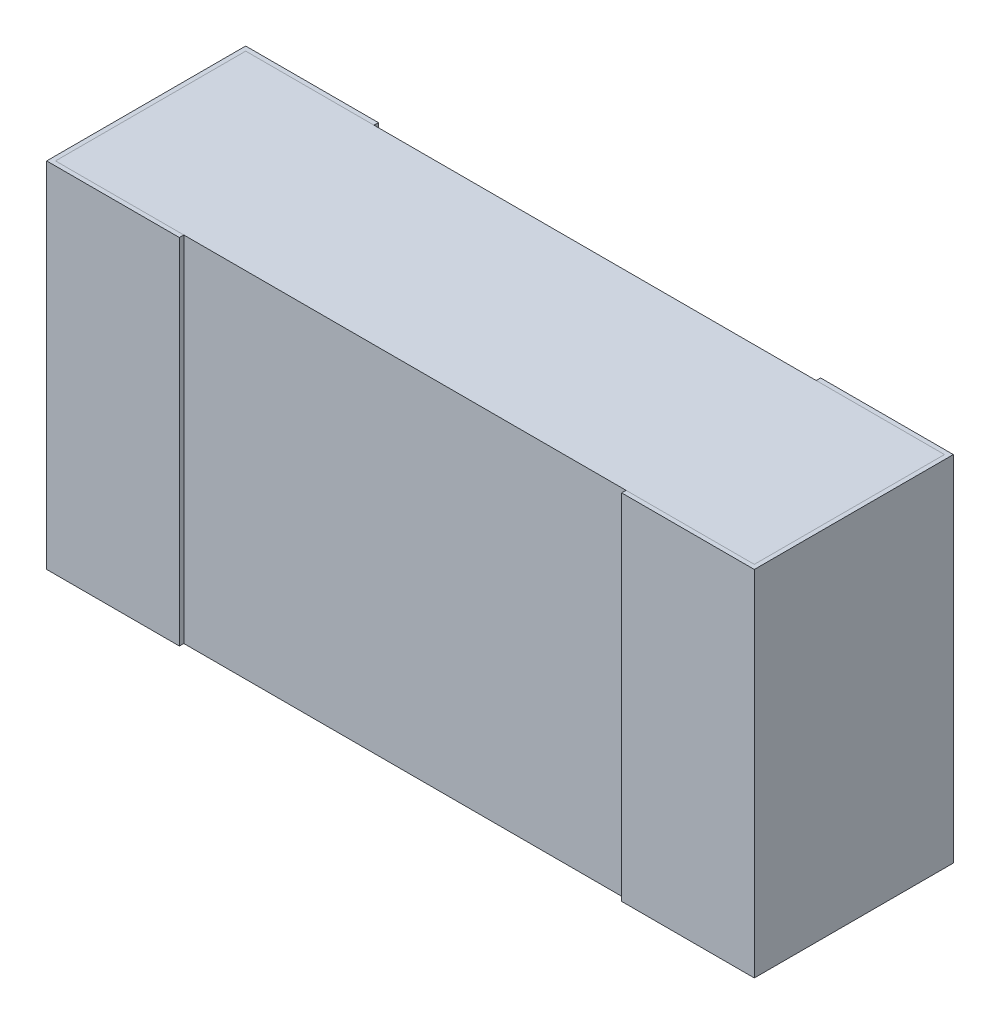
ISO-10303-21;
HEADER;
FILE_DESCRIPTION(('STEP AP214'),'2;1');
FILE_NAME('part.step','',(''),(''),'','','');
FILE_SCHEMA(('AUTOMOTIVE_DESIGN { 1 0 10303 214 1 1 1 1 }'));
ENDSEC;
DATA;
#1=APPLICATION_CONTEXT('core data for automotive mechanical design processes');
#2=APPLICATION_PROTOCOL_DEFINITION('international standard','automotive_design',2000,#1);
#3=PRODUCT_CONTEXT('',#1,'mechanical');
#4=PRODUCT('Part','Part','',(#3));
#5=PRODUCT_RELATED_PRODUCT_CATEGORY('part','',(#4));
#6=PRODUCT_DEFINITION_FORMATION('','',#4);
#7=PRODUCT_DEFINITION_CONTEXT('part definition',#1,'design');
#8=PRODUCT_DEFINITION('design','',#6,#7);
#9=PRODUCT_DEFINITION_SHAPE('','',#8);
#10=(LENGTH_UNIT() NAMED_UNIT(*) SI_UNIT(.MILLI.,.METRE.));
#11=(NAMED_UNIT(*) PLANE_ANGLE_UNIT() SI_UNIT($,.RADIAN.));
#12=(NAMED_UNIT(*) SI_UNIT($,.STERADIAN.) SOLID_ANGLE_UNIT());
#13=UNCERTAINTY_MEASURE_WITH_UNIT(LENGTH_MEASURE(1.E-05),#10,'distance_accuracy_value','');
#14=(GEOMETRIC_REPRESENTATION_CONTEXT(3) GLOBAL_UNCERTAINTY_ASSIGNED_CONTEXT((#13)) GLOBAL_UNIT_ASSIGNED_CONTEXT((#10,
#11,#12)) REPRESENTATION_CONTEXT('',''));
#15=CARTESIAN_POINT('',(0.,0.,0.));
#16=DIRECTION('',(0.,0.,1.));
#17=DIRECTION('',(1.,0.,0.));
#18=AXIS2_PLACEMENT_3D('',#15,#16,#17);
#19=CARTESIAN_POINT('',(0.79,2.03746755693052,-0.0216121610286598));
#20=DIRECTION('',(0.,0.,-1.));
#21=DIRECTION('',(-1.,0.,0.));
#22=AXIS2_PLACEMENT_3D('',#19,#20,#21);
#23=PLANE('',#22);
#24=DIRECTION('',(1.,0.,0.));
#25=VECTOR('',#24,1.);
#26=CARTESIAN_POINT('',(0.79,0.4,-0.0216121610286598));
#27=LINE('',#26,#25);
#28=CARTESIAN_POINT('',(-0.79,0.4,-0.0216121610286598));
#29=VERTEX_POINT('',#28);
#30=CARTESIAN_POINT('',(0.79,0.4,-0.0216121610286598));
#31=VERTEX_POINT('',#30);
#32=EDGE_CURVE('E112',#29,#31,#27,.T.);
#33=ORIENTED_EDGE('',*,*,#32,.F.);
#34=DIRECTION('',(0.,-1.,0.));
#35=VECTOR('',#34,1.);
#36=CARTESIAN_POINT('',(-0.79,2.03746755693052,-0.0216121610286598));
#37=LINE('',#36,#35);
#38=CARTESIAN_POINT('',(-0.79,-0.4,-0.0216121610286598));
#39=VERTEX_POINT('',#38);
#40=EDGE_CURVE('E50',#29,#39,#37,.T.);
#41=ORIENTED_EDGE('',*,*,#40,.T.);
#42=DIRECTION('',(-1.,0.,0.));
#43=VECTOR('',#42,1.);
#44=CARTESIAN_POINT('',(0.79,-0.4,-0.0216121610286598));
#45=LINE('',#44,#43);
#46=CARTESIAN_POINT('',(0.79,-0.4,-0.0216121610286598));
#47=VERTEX_POINT('',#46);
#48=EDGE_CURVE('E106',#47,#39,#45,.T.);
#49=ORIENTED_EDGE('',*,*,#48,.F.);
#50=DIRECTION('',(0.,-1.,0.));
#51=VECTOR('',#50,1.);
#52=CARTESIAN_POINT('',(0.79,2.03746755693052,-0.0216121610286598));
#53=LINE('',#52,#51);
#54=EDGE_CURVE('E95',#31,#47,#53,.T.);
#55=ORIENTED_EDGE('',*,*,#54,.F.);
#56=EDGE_LOOP('',(#33,#41,#49,#55));
#57=FACE_BOUND('',#56,.T.);
#58=ADVANCED_FACE('F46',(#57),#23,.F.);
#59=CARTESIAN_POINT('',(0.79,2.03746755693052,-0.0216121610286598));
#60=DIRECTION('',(-1.,0.,0.));
#61=DIRECTION('',(0.,0.,1.));
#62=AXIS2_PLACEMENT_3D('',#59,#60,#61);
#63=PLANE('',#62);
#64=DIRECTION('',(0.,0.,-1.));
#65=VECTOR('',#64,1.);
#66=CARTESIAN_POINT('',(0.79,0.4,-0.0216121610286598));
#67=LINE('',#66,#65);
#68=CARTESIAN_POINT('',(0.79,0.4,-0.45161216102866));
#69=VERTEX_POINT('',#68);
#70=EDGE_CURVE('E55',#31,#69,#67,.T.);
#71=ORIENTED_EDGE('',*,*,#70,.F.);
#72=ORIENTED_EDGE('',*,*,#54,.T.);
#73=DIRECTION('',(0.,0.,1.));
#74=VECTOR('',#73,1.);
#75=CARTESIAN_POINT('',(0.79,-0.4,-0.0216121610286598));
#76=LINE('',#75,#74);
#77=CARTESIAN_POINT('',(0.79,-0.4,-0.45161216102866));
#78=VERTEX_POINT('',#77);
#79=EDGE_CURVE('E101',#78,#47,#76,.T.);
#80=ORIENTED_EDGE('',*,*,#79,.F.);
#81=DIRECTION('',(0.,-1.,0.));
#82=VECTOR('',#81,1.);
#83=CARTESIAN_POINT('',(0.79,2.03746755693052,-0.45161216102866));
#84=LINE('',#83,#82);
#85=EDGE_CURVE('E90',#69,#78,#84,.T.);
#86=ORIENTED_EDGE('',*,*,#85,.F.);
#87=EDGE_LOOP('',(#71,#72,#80,#86));
#88=FACE_BOUND('',#87,.T.);
#89=ADVANCED_FACE('F105',(#88),#63,.F.);
#90=CARTESIAN_POINT('',(0.79,2.03746755693052,-0.45161216102866));
#91=DIRECTION('',(0.,0.,1.));
#92=DIRECTION('',(1.,0.,0.));
#93=AXIS2_PLACEMENT_3D('',#90,#91,#92);
#94=PLANE('',#93);
#95=DIRECTION('',(-1.,0.,0.));
#96=VECTOR('',#95,1.);
#97=CARTESIAN_POINT('',(0.79,0.4,-0.45161216102866));
#98=LINE('',#97,#96);
#99=CARTESIAN_POINT('',(-0.79,0.4,-0.45161216102866));
#100=VERTEX_POINT('',#99);
#101=EDGE_CURVE('E12',#69,#100,#98,.T.);
#102=ORIENTED_EDGE('',*,*,#101,.F.);
#103=ORIENTED_EDGE('',*,*,#85,.T.);
#104=DIRECTION('',(1.,0.,0.));
#105=VECTOR('',#104,1.);
#106=CARTESIAN_POINT('',(0.79,-0.4,-0.45161216102866));
#107=LINE('',#106,#105);
#108=CARTESIAN_POINT('',(-0.79,-0.4,-0.45161216102866));
#109=VERTEX_POINT('',#108);
#110=EDGE_CURVE('E93',#109,#78,#107,.T.);
#111=ORIENTED_EDGE('',*,*,#110,.F.);
#112=DIRECTION('',(0.,-1.,0.));
#113=VECTOR('',#112,1.);
#114=CARTESIAN_POINT('',(-0.79,2.03746755693052,-0.45161216102866));
#115=LINE('',#114,#113);
#116=EDGE_CURVE('E71',#100,#109,#115,.T.);
#117=ORIENTED_EDGE('',*,*,#116,.F.);
#118=EDGE_LOOP('',(#102,#103,#111,#117));
#119=FACE_BOUND('',#118,.T.);
#120=ADVANCED_FACE('F92',(#119),#94,.F.);
#121=CARTESIAN_POINT('',(-0.79,2.03746755693052,-0.0216121610286598));
#122=DIRECTION('',(1.,0.,0.));
#123=DIRECTION('',(0.,0.,-1.));
#124=AXIS2_PLACEMENT_3D('',#121,#122,#123);
#125=PLANE('',#124);
#126=DIRECTION('',(0.,0.,1.));
#127=VECTOR('',#126,1.);
#128=CARTESIAN_POINT('',(-0.79,0.4,-0.0216121610286598));
#129=LINE('',#128,#127);
#130=EDGE_CURVE('E115',#100,#29,#129,.T.);
#131=ORIENTED_EDGE('',*,*,#130,.F.);
#132=ORIENTED_EDGE('',*,*,#116,.T.);
#133=DIRECTION('',(0.,0.,-1.));
#134=VECTOR('',#133,1.);
#135=CARTESIAN_POINT('',(-0.79,-0.4,-0.0216121610286598));
#136=LINE('',#135,#134);
#137=EDGE_CURVE('E103',#39,#109,#136,.T.);
#138=ORIENTED_EDGE('',*,*,#137,.F.);
#139=ORIENTED_EDGE('',*,*,#40,.F.);
#140=EDGE_LOOP('',(#131,#132,#138,#139));
#141=FACE_BOUND('',#140,.T.);
#142=ADVANCED_FACE('F119',(#141),#125,.F.);
#143=CARTESIAN_POINT('',(0.8,0.4,-0.0116121610286598));
#144=DIRECTION('',(0.,1.,0.));
#145=DIRECTION('',(0.,0.,1.));
#146=AXIS2_PLACEMENT_3D('',#143,#144,#145);
#147=PLANE('',#146);
#148=ORIENTED_EDGE('',*,*,#130,.T.);
#149=ORIENTED_EDGE('',*,*,#32,.T.);
#150=ORIENTED_EDGE('',*,*,#70,.T.);
#151=ORIENTED_EDGE('',*,*,#101,.T.);
#152=EDGE_LOOP('',(#148,#149,#150,#151));
#153=FACE_BOUND('',#152,.T.);
#154=ADVANCED_FACE('F48',(#153),#147,.T.);
#155=CARTESIAN_POINT('',(0.8,-0.4,-0.0116121610286598));
#156=DIRECTION('',(0.,1.,0.));
#157=DIRECTION('',(0.,0.,1.));
#158=AXIS2_PLACEMENT_3D('',#155,#156,#157);
#159=PLANE('',#158);
#160=ORIENTED_EDGE('',*,*,#48,.T.);
#161=ORIENTED_EDGE('',*,*,#137,.T.);
#162=ORIENTED_EDGE('',*,*,#110,.T.);
#163=ORIENTED_EDGE('',*,*,#79,.T.);
#164=EDGE_LOOP('',(#160,#161,#162,#163));
#165=FACE_BOUND('',#164,.T.);
#166=ADVANCED_FACE('F100',(#165),#159,.F.);
#167=CLOSED_SHELL('',(#58,#89,#120,#142,#154,#166));
#168=MANIFOLD_SOLID_BREP('B2',#167);
#169=CARTESIAN_POINT('',(-0.5,0.4,-0.0116121610286598));
#170=DIRECTION('',(-1.,0.,0.));
#171=DIRECTION('',(0.,0.,1.));
#172=AXIS2_PLACEMENT_3D('',#169,#170,#171);
#173=PLANE('',#172);
#174=DIRECTION('',(0.,0.,-1.));
#175=VECTOR('',#174,1.);
#176=CARTESIAN_POINT('',(-0.5,-0.4,-0.0116121610286598));
#177=LINE('',#176,#175);
#178=CARTESIAN_POINT('',(-0.5,-0.4,-0.0116121610286598));
#179=VERTEX_POINT('',#178);
#180=CARTESIAN_POINT('',(-0.5,-0.4,-0.0216121610286598));
#181=VERTEX_POINT('',#180);
#182=EDGE_CURVE('E275',#179,#181,#177,.T.);
#183=ORIENTED_EDGE('',*,*,#182,.T.);
#184=DIRECTION('',(0.,-1.,0.));
#185=VECTOR('',#184,1.);
#186=CARTESIAN_POINT('',(-0.5,0.4,-0.0216121610286598));
#187=LINE('',#186,#185);
#188=CARTESIAN_POINT('',(-0.5,0.4,-0.0216121610286598));
#189=VERTEX_POINT('',#188);
#190=EDGE_CURVE('E44',#189,#181,#187,.T.);
#191=ORIENTED_EDGE('',*,*,#190,.F.);
#192=DIRECTION('',(0.,0.,-1.));
#193=VECTOR('',#192,1.);
#194=CARTESIAN_POINT('',(-0.5,0.4,-0.0116121610286598));
#195=LINE('',#194,#193);
#196=CARTESIAN_POINT('',(-0.5,0.4,-0.0116121610286598));
#197=VERTEX_POINT('',#196);
#198=EDGE_CURVE('E289',#197,#189,#195,.T.);
#199=ORIENTED_EDGE('',*,*,#198,.F.);
#200=DIRECTION('',(0.,-1.,0.));
#201=VECTOR('',#200,1.);
#202=CARTESIAN_POINT('',(-0.5,0.4,-0.0116121610286598));
#203=LINE('',#202,#201);
#204=EDGE_CURVE('E271',#197,#179,#203,.T.);
#205=ORIENTED_EDGE('',*,*,#204,.T.);
#206=EDGE_LOOP('',(#183,#191,#199,#205));
#207=FACE_BOUND('',#206,.T.);
#208=ADVANCED_FACE('F179',(#207),#173,.F.);
#209=CARTESIAN_POINT('',(-0.5,0.4,-0.0216121610286598));
#210=DIRECTION('',(0.,0.,1.));
#211=DIRECTION('',(1.,0.,0.));
#212=AXIS2_PLACEMENT_3D('',#209,#210,#211);
#213=PLANE('',#212);
#214=DIRECTION('',(-1.,0.,0.));
#215=VECTOR('',#214,1.);
#216=CARTESIAN_POINT('',(-0.5,-0.4,-0.0216121610286598));
#217=LINE('',#216,#215);
#218=CARTESIAN_POINT('',(-0.79,-0.4,-0.0216121610286598));
#219=VERTEX_POINT('',#218);
#220=EDGE_CURVE('E278',#181,#219,#217,.T.);
#221=ORIENTED_EDGE('',*,*,#220,.T.);
#222=DIRECTION('',(0.,-1.,0.));
#223=VECTOR('',#222,1.);
#224=CARTESIAN_POINT('',(-0.79,0.4,-0.0216121610286598));
#225=LINE('',#224,#223);
#226=CARTESIAN_POINT('',(-0.79,0.4,-0.0216121610286598));
#227=VERTEX_POINT('',#226);
#228=EDGE_CURVE('E187',#227,#219,#225,.T.);
#229=ORIENTED_EDGE('',*,*,#228,.F.);
#230=DIRECTION('',(-1.,0.,0.));
#231=VECTOR('',#230,1.);
#232=CARTESIAN_POINT('',(-0.5,0.4,-0.0216121610286598));
#233=LINE('',#232,#231);
#234=EDGE_CURVE('E238',#189,#227,#233,.T.);
#235=ORIENTED_EDGE('',*,*,#234,.F.);
#236=ORIENTED_EDGE('',*,*,#190,.T.);
#237=EDGE_LOOP('',(#221,#229,#235,#236));
#238=FACE_BOUND('',#237,.T.);
#239=ADVANCED_FACE('F324',(#238),#213,.F.);
#240=CARTESIAN_POINT('',(-0.79,0.4,-0.0216121610286598));
#241=DIRECTION('',(-1.,0.,0.));
#242=DIRECTION('',(0.,0.,1.));
#243=AXIS2_PLACEMENT_3D('',#240,#241,#242);
#244=PLANE('',#243);
#245=DIRECTION('',(0.,0.,-1.));
#246=VECTOR('',#245,1.);
#247=CARTESIAN_POINT('',(-0.79,-0.4,-0.0216121610286598));
#248=LINE('',#247,#246);
#249=CARTESIAN_POINT('',(-0.79,-0.4,-0.45161216102866));
#250=VERTEX_POINT('',#249);
#251=EDGE_CURVE('E280',#219,#250,#248,.T.);
#252=ORIENTED_EDGE('',*,*,#251,.T.);
#253=DIRECTION('',(0.,-1.,0.));
#254=VECTOR('',#253,1.);
#255=CARTESIAN_POINT('',(-0.79,0.4,-0.45161216102866));
#256=LINE('',#255,#254);
#257=CARTESIAN_POINT('',(-0.79,0.4,-0.45161216102866));
#258=VERTEX_POINT('',#257);
#259=EDGE_CURVE('E296',#258,#250,#256,.T.);
#260=ORIENTED_EDGE('',*,*,#259,.F.);
#261=DIRECTION('',(0.,0.,-1.));
#262=VECTOR('',#261,1.);
#263=CARTESIAN_POINT('',(-0.79,0.4,-0.0216121610286598));
#264=LINE('',#263,#262);
#265=EDGE_CURVE('E304',#227,#258,#264,.T.);
#266=ORIENTED_EDGE('',*,*,#265,.F.);
#267=ORIENTED_EDGE('',*,*,#228,.T.);
#268=EDGE_LOOP('',(#252,#260,#266,#267));
#269=FACE_BOUND('',#268,.T.);
#270=ADVANCED_FACE('F302',(#269),#244,.F.);
#271=CARTESIAN_POINT('',(-0.79,0.4,-0.45161216102866));
#272=DIRECTION('',(0.,0.,-1.));
#273=DIRECTION('',(-1.,0.,0.));
#274=AXIS2_PLACEMENT_3D('',#271,#272,#273);
#275=PLANE('',#274);
#276=DIRECTION('',(1.,0.,0.));
#277=VECTOR('',#276,1.);
#278=CARTESIAN_POINT('',(-0.79,-0.4,-0.45161216102866));
#279=LINE('',#278,#277);
#280=CARTESIAN_POINT('',(-0.5,-0.4,-0.45161216102866));
#281=VERTEX_POINT('',#280);
#282=EDGE_CURVE('E282',#250,#281,#279,.T.);
#283=ORIENTED_EDGE('',*,*,#282,.T.);
#284=DIRECTION('',(0.,-1.,0.));
#285=VECTOR('',#284,1.);
#286=CARTESIAN_POINT('',(-0.5,0.4,-0.45161216102866));
#287=LINE('',#286,#285);
#288=CARTESIAN_POINT('',(-0.5,0.4,-0.45161216102866));
#289=VERTEX_POINT('',#288);
#290=EDGE_CURVE('E293',#289,#281,#287,.T.);
#291=ORIENTED_EDGE('',*,*,#290,.F.);
#292=DIRECTION('',(1.,0.,0.));
#293=VECTOR('',#292,1.);
#294=CARTESIAN_POINT('',(-0.79,0.4,-0.45161216102866));
#295=LINE('',#294,#293);
#296=EDGE_CURVE('E316',#258,#289,#295,.T.);
#297=ORIENTED_EDGE('',*,*,#296,.F.);
#298=ORIENTED_EDGE('',*,*,#259,.T.);
#299=EDGE_LOOP('',(#283,#291,#297,#298));
#300=FACE_BOUND('',#299,.T.);
#301=ADVANCED_FACE('F312',(#300),#275,.F.);
#302=CARTESIAN_POINT('',(-0.5,0.4,-0.45161216102866));
#303=DIRECTION('',(-1.,0.,0.));
#304=DIRECTION('',(0.,0.,1.));
#305=AXIS2_PLACEMENT_3D('',#302,#303,#304);
#306=PLANE('',#305);
#307=DIRECTION('',(0.,0.,-1.));
#308=VECTOR('',#307,1.);
#309=CARTESIAN_POINT('',(-0.5,-0.4,-0.45161216102866));
#310=LINE('',#309,#308);
#311=CARTESIAN_POINT('',(-0.5,-0.4,-0.46161216102866));
#312=VERTEX_POINT('',#311);
#313=EDGE_CURVE('E284',#281,#312,#310,.T.);
#314=ORIENTED_EDGE('',*,*,#313,.T.);
#315=DIRECTION('',(0.,-1.,0.));
#316=VECTOR('',#315,1.);
#317=CARTESIAN_POINT('',(-0.5,0.4,-0.46161216102866));
#318=LINE('',#317,#316);
#319=CARTESIAN_POINT('',(-0.5,0.4,-0.46161216102866));
#320=VERTEX_POINT('',#319);
#321=EDGE_CURVE('E266',#320,#312,#318,.T.);
#322=ORIENTED_EDGE('',*,*,#321,.F.);
#323=DIRECTION('',(0.,0.,-1.));
#324=VECTOR('',#323,1.);
#325=CARTESIAN_POINT('',(-0.5,0.4,-0.45161216102866));
#326=LINE('',#325,#324);
#327=EDGE_CURVE('E257',#289,#320,#326,.T.);
#328=ORIENTED_EDGE('',*,*,#327,.F.);
#329=ORIENTED_EDGE('',*,*,#290,.T.);
#330=EDGE_LOOP('',(#314,#322,#328,#329));
#331=FACE_BOUND('',#330,.T.);
#332=ADVANCED_FACE('F315',(#331),#306,.F.);
#333=CARTESIAN_POINT('',(-0.8,0.4,-0.46161216102866));
#334=DIRECTION('',(0.,0.,1.));
#335=DIRECTION('',(1.,0.,0.));
#336=AXIS2_PLACEMENT_3D('',#333,#334,#335);
#337=PLANE('',#336);
#338=DIRECTION('',(-1.,0.,0.));
#339=VECTOR('',#338,1.);
#340=CARTESIAN_POINT('',(-0.8,-0.4,-0.46161216102866));
#341=LINE('',#340,#339);
#342=CARTESIAN_POINT('',(-0.8,-0.4,-0.46161216102866));
#343=VERTEX_POINT('',#342);
#344=EDGE_CURVE('E265',#312,#343,#341,.T.);
#345=ORIENTED_EDGE('',*,*,#344,.T.);
#346=DIRECTION('',(0.,-1.,0.));
#347=VECTOR('',#346,1.);
#348=CARTESIAN_POINT('',(-0.8,0.4,-0.46161216102866));
#349=LINE('',#348,#347);
#350=CARTESIAN_POINT('',(-0.8,0.4,-0.46161216102866));
#351=VERTEX_POINT('',#350);
#352=EDGE_CURVE('E262',#351,#343,#349,.T.);
#353=ORIENTED_EDGE('',*,*,#352,.F.);
#354=DIRECTION('',(-1.,0.,0.));
#355=VECTOR('',#354,1.);
#356=CARTESIAN_POINT('',(-0.8,0.4,-0.46161216102866));
#357=LINE('',#356,#355);
#358=EDGE_CURVE('E251',#320,#351,#357,.T.);
#359=ORIENTED_EDGE('',*,*,#358,.F.);
#360=ORIENTED_EDGE('',*,*,#321,.T.);
#361=EDGE_LOOP('',(#345,#353,#359,#360));
#362=FACE_BOUND('',#361,.T.);
#363=ADVANCED_FACE('F263',(#362),#337,.F.);
#364=CARTESIAN_POINT('',(-0.8,0.4,-0.0116121610286598));
#365=DIRECTION('',(1.,0.,0.));
#366=DIRECTION('',(0.,0.,-1.));
#367=AXIS2_PLACEMENT_3D('',#364,#365,#366);
#368=PLANE('',#367);
#369=DIRECTION('',(0.,0.,1.));
#370=VECTOR('',#369,1.);
#371=CARTESIAN_POINT('',(-0.8,-0.4,-0.0116121610286598));
#372=LINE('',#371,#370);
#373=CARTESIAN_POINT('',(-0.8,-0.4,-0.0116121610286598));
#374=VERTEX_POINT('',#373);
#375=EDGE_CURVE('E224',#343,#374,#372,.T.);
#376=ORIENTED_EDGE('',*,*,#375,.T.);
#377=DIRECTION('',(0.,-1.,0.));
#378=VECTOR('',#377,1.);
#379=CARTESIAN_POINT('',(-0.8,0.4,-0.0116121610286598));
#380=LINE('',#379,#378);
#381=CARTESIAN_POINT('',(-0.8,0.4,-0.0116121610286598));
#382=VERTEX_POINT('',#381);
#383=EDGE_CURVE('E267',#382,#374,#380,.T.);
#384=ORIENTED_EDGE('',*,*,#383,.F.);
#385=DIRECTION('',(0.,0.,1.));
#386=VECTOR('',#385,1.);
#387=CARTESIAN_POINT('',(-0.8,0.4,-0.0116121610286598));
#388=LINE('',#387,#386);
#389=EDGE_CURVE('E255',#351,#382,#388,.T.);
#390=ORIENTED_EDGE('',*,*,#389,.F.);
#391=ORIENTED_EDGE('',*,*,#352,.T.);
#392=EDGE_LOOP('',(#376,#384,#390,#391));
#393=FACE_BOUND('',#392,.T.);
#394=ADVANCED_FACE('F269',(#393),#368,.F.);
#395=CARTESIAN_POINT('',(-0.5,0.4,-0.0116121610286598));
#396=DIRECTION('',(0.,0.,-1.));
#397=DIRECTION('',(-1.,0.,0.));
#398=AXIS2_PLACEMENT_3D('',#395,#396,#397);
#399=PLANE('',#398);
#400=DIRECTION('',(1.,0.,0.));
#401=VECTOR('',#400,1.);
#402=CARTESIAN_POINT('',(-0.5,-0.4,-0.0116121610286598));
#403=LINE('',#402,#401);
#404=EDGE_CURVE('E230',#374,#179,#403,.T.);
#405=ORIENTED_EDGE('',*,*,#404,.T.);
#406=ORIENTED_EDGE('',*,*,#204,.F.);
#407=DIRECTION('',(1.,0.,0.));
#408=VECTOR('',#407,1.);
#409=CARTESIAN_POINT('',(-0.5,0.4,-0.0116121610286598));
#410=LINE('',#409,#408);
#411=EDGE_CURVE('E195',#382,#197,#410,.T.);
#412=ORIENTED_EDGE('',*,*,#411,.F.);
#413=ORIENTED_EDGE('',*,*,#383,.T.);
#414=EDGE_LOOP('',(#405,#406,#412,#413));
#415=FACE_BOUND('',#414,.T.);
#416=ADVANCED_FACE('F340',(#415),#399,.F.);
#417=CARTESIAN_POINT('',(-0.5,0.4,-0.0216121610286598));
#418=DIRECTION('',(0.,1.,0.));
#419=DIRECTION('',(0.,0.,1.));
#420=AXIS2_PLACEMENT_3D('',#417,#418,#419);
#421=PLANE('',#420);
#422=ORIENTED_EDGE('',*,*,#198,.T.);
#423=ORIENTED_EDGE('',*,*,#234,.T.);
#424=ORIENTED_EDGE('',*,*,#265,.T.);
#425=ORIENTED_EDGE('',*,*,#296,.T.);
#426=ORIENTED_EDGE('',*,*,#327,.T.);
#427=ORIENTED_EDGE('',*,*,#358,.T.);
#428=ORIENTED_EDGE('',*,*,#389,.T.);
#429=ORIENTED_EDGE('',*,*,#411,.T.);
#430=EDGE_LOOP('',(#422,#423,#424,#425,#426,#427,#428,#429));
#431=FACE_BOUND('',#430,.T.);
#432=ADVANCED_FACE('F253',(#431),#421,.T.);
#433=CARTESIAN_POINT('',(-0.5,-0.4,-0.0216121610286598));
#434=DIRECTION('',(0.,1.,0.));
#435=DIRECTION('',(0.,0.,1.));
#436=AXIS2_PLACEMENT_3D('',#433,#434,#435);
#437=PLANE('',#436);
#438=ORIENTED_EDGE('',*,*,#182,.F.);
#439=ORIENTED_EDGE('',*,*,#404,.F.);
#440=ORIENTED_EDGE('',*,*,#375,.F.);
#441=ORIENTED_EDGE('',*,*,#344,.F.);
#442=ORIENTED_EDGE('',*,*,#313,.F.);
#443=ORIENTED_EDGE('',*,*,#282,.F.);
#444=ORIENTED_EDGE('',*,*,#251,.F.);
#445=ORIENTED_EDGE('',*,*,#220,.F.);
#446=EDGE_LOOP('',(#438,#439,#440,#441,#442,#443,#444,#445));
#447=FACE_BOUND('',#446,.T.);
#448=ADVANCED_FACE('F308',(#447),#437,.F.);
#449=CLOSED_SHELL('',(#208,#239,#270,#301,#332,#363,#394,#416,#432,#448));
#450=MANIFOLD_SOLID_BREP('B6',#449);
#451=CARTESIAN_POINT('',(0.5,0.4,-0.0116121610286598));
#452=DIRECTION('',(0.,0.,-1.));
#453=DIRECTION('',(-1.,0.,0.));
#454=AXIS2_PLACEMENT_3D('',#451,#452,#453);
#455=PLANE('',#454);
#456=DIRECTION('',(1.,0.,0.));
#457=VECTOR('',#456,1.);
#458=CARTESIAN_POINT('',(0.5,-0.4,-0.0116121610286598));
#459=LINE('',#458,#457);
#460=CARTESIAN_POINT('',(0.5,-0.4,-0.0116121610286598));
#461=VERTEX_POINT('',#460);
#462=CARTESIAN_POINT('',(0.8,-0.4,-0.0116121610286598));
#463=VERTEX_POINT('',#462);
#464=EDGE_CURVE('E503',#461,#463,#459,.T.);
#465=ORIENTED_EDGE('',*,*,#464,.T.);
#466=DIRECTION('',(0.,-1.,0.));
#467=VECTOR('',#466,1.);
#468=CARTESIAN_POINT('',(0.8,0.4,-0.0116121610286598));
#469=LINE('',#468,#467);
#470=CARTESIAN_POINT('',(0.8,0.4,-0.0116121610286598));
#471=VERTEX_POINT('',#470);
#472=EDGE_CURVE('E177',#471,#463,#469,.T.);
#473=ORIENTED_EDGE('',*,*,#472,.F.);
#474=DIRECTION('',(1.,0.,0.));
#475=VECTOR('',#474,1.);
#476=CARTESIAN_POINT('',(0.5,0.4,-0.0116121610286598));
#477=LINE('',#476,#475);
#478=CARTESIAN_POINT('',(0.5,0.4,-0.0116121610286598));
#479=VERTEX_POINT('',#478);
#480=EDGE_CURVE('E517',#479,#471,#477,.T.);
#481=ORIENTED_EDGE('',*,*,#480,.F.);
#482=DIRECTION('',(0.,-1.,0.));
#483=VECTOR('',#482,1.);
#484=CARTESIAN_POINT('',(0.5,0.4,-0.0116121610286598));
#485=LINE('',#484,#483);
#486=EDGE_CURVE('E499',#479,#461,#485,.T.);
#487=ORIENTED_EDGE('',*,*,#486,.T.);
#488=EDGE_LOOP('',(#465,#473,#481,#487));
#489=FACE_BOUND('',#488,.T.);
#490=ADVANCED_FACE('F407',(#489),#455,.F.);
#491=CARTESIAN_POINT('',(0.8,0.4,-0.0116121610286598));
#492=DIRECTION('',(-1.,0.,0.));
#493=DIRECTION('',(0.,0.,1.));
#494=AXIS2_PLACEMENT_3D('',#491,#492,#493);
#495=PLANE('',#494);
#496=DIRECTION('',(0.,0.,-1.));
#497=VECTOR('',#496,1.);
#498=CARTESIAN_POINT('',(0.8,-0.4,-0.0116121610286598));
#499=LINE('',#498,#497);
#500=CARTESIAN_POINT('',(0.8,-0.4,-0.46161216102866));
#501=VERTEX_POINT('',#500);
#502=EDGE_CURVE('E506',#463,#501,#499,.T.);
#503=ORIENTED_EDGE('',*,*,#502,.T.);
#504=DIRECTION('',(0.,-1.,0.));
#505=VECTOR('',#504,1.);
#506=CARTESIAN_POINT('',(0.8,0.4,-0.46161216102866));
#507=LINE('',#506,#505);
#508=CARTESIAN_POINT('',(0.8,0.4,-0.46161216102866));
#509=VERTEX_POINT('',#508);
#510=EDGE_CURVE('E415',#509,#501,#507,.T.);
#511=ORIENTED_EDGE('',*,*,#510,.F.);
#512=DIRECTION('',(0.,0.,-1.));
#513=VECTOR('',#512,1.);
#514=CARTESIAN_POINT('',(0.8,0.4,-0.0116121610286598));
#515=LINE('',#514,#513);
#516=EDGE_CURVE('E466',#471,#509,#515,.T.);
#517=ORIENTED_EDGE('',*,*,#516,.F.);
#518=ORIENTED_EDGE('',*,*,#472,.T.);
#519=EDGE_LOOP('',(#503,#511,#517,#518));
#520=FACE_BOUND('',#519,.T.);
#521=ADVANCED_FACE('F552',(#520),#495,.F.);
#522=CARTESIAN_POINT('',(0.8,0.4,-0.46161216102866));
#523=DIRECTION('',(0.,0.,1.));
#524=DIRECTION('',(1.,0.,0.));
#525=AXIS2_PLACEMENT_3D('',#522,#523,#524);
#526=PLANE('',#525);
#527=DIRECTION('',(-1.,0.,0.));
#528=VECTOR('',#527,1.);
#529=CARTESIAN_POINT('',(0.8,-0.4,-0.46161216102866));
#530=LINE('',#529,#528);
#531=CARTESIAN_POINT('',(0.5,-0.4,-0.46161216102866));
#532=VERTEX_POINT('',#531);
#533=EDGE_CURVE('E508',#501,#532,#530,.T.);
#534=ORIENTED_EDGE('',*,*,#533,.T.);
#535=DIRECTION('',(0.,-1.,0.));
#536=VECTOR('',#535,1.);
#537=CARTESIAN_POINT('',(0.5,0.4,-0.46161216102866));
#538=LINE('',#537,#536);
#539=CARTESIAN_POINT('',(0.5,0.4,-0.46161216102866));
#540=VERTEX_POINT('',#539);
#541=EDGE_CURVE('E524',#540,#532,#538,.T.);
#542=ORIENTED_EDGE('',*,*,#541,.F.);
#543=DIRECTION('',(-1.,0.,0.));
#544=VECTOR('',#543,1.);
#545=CARTESIAN_POINT('',(0.8,0.4,-0.46161216102866));
#546=LINE('',#545,#544);
#547=EDGE_CURVE('E532',#509,#540,#546,.T.);
#548=ORIENTED_EDGE('',*,*,#547,.F.);
#549=ORIENTED_EDGE('',*,*,#510,.T.);
#550=EDGE_LOOP('',(#534,#542,#548,#549));
#551=FACE_BOUND('',#550,.T.);
#552=ADVANCED_FACE('F530',(#551),#526,.F.);
#553=CARTESIAN_POINT('',(0.5,0.4,-0.45161216102866));
#554=DIRECTION('',(1.,0.,0.));
#555=DIRECTION('',(0.,0.,-1.));
#556=AXIS2_PLACEMENT_3D('',#553,#554,#555);
#557=PLANE('',#556);
#558=DIRECTION('',(0.,0.,1.));
#559=VECTOR('',#558,1.);
#560=CARTESIAN_POINT('',(0.5,-0.4,-0.45161216102866));
#561=LINE('',#560,#559);
#562=CARTESIAN_POINT('',(0.5,-0.4,-0.45161216102866));
#563=VERTEX_POINT('',#562);
#564=EDGE_CURVE('E510',#532,#563,#561,.T.);
#565=ORIENTED_EDGE('',*,*,#564,.T.);
#566=DIRECTION('',(0.,-1.,0.));
#567=VECTOR('',#566,1.);
#568=CARTESIAN_POINT('',(0.5,0.4,-0.45161216102866));
#569=LINE('',#568,#567);
#570=CARTESIAN_POINT('',(0.5,0.4,-0.45161216102866));
#571=VERTEX_POINT('',#570);
#572=EDGE_CURVE('E521',#571,#563,#569,.T.);
#573=ORIENTED_EDGE('',*,*,#572,.F.);
#574=DIRECTION('',(0.,0.,1.));
#575=VECTOR('',#574,1.);
#576=CARTESIAN_POINT('',(0.5,0.4,-0.45161216102866));
#577=LINE('',#576,#575);
#578=EDGE_CURVE('E544',#540,#571,#577,.T.);
#579=ORIENTED_EDGE('',*,*,#578,.F.);
#580=ORIENTED_EDGE('',*,*,#541,.T.);
#581=EDGE_LOOP('',(#565,#573,#579,#580));
#582=FACE_BOUND('',#581,.T.);
#583=ADVANCED_FACE('F540',(#582),#557,.F.);
#584=CARTESIAN_POINT('',(0.79,0.4,-0.45161216102866));
#585=DIRECTION('',(0.,0.,-1.));
#586=DIRECTION('',(-1.,0.,0.));
#587=AXIS2_PLACEMENT_3D('',#584,#585,#586);
#588=PLANE('',#587);
#589=DIRECTION('',(1.,0.,0.));
#590=VECTOR('',#589,1.);
#591=CARTESIAN_POINT('',(0.79,-0.4,-0.45161216102866));
#592=LINE('',#591,#590);
#593=CARTESIAN_POINT('',(0.79,-0.4,-0.45161216102866));
#594=VERTEX_POINT('',#593);
#595=EDGE_CURVE('E512',#563,#594,#592,.T.);
#596=ORIENTED_EDGE('',*,*,#595,.T.);
#597=DIRECTION('',(0.,-1.,0.));
#598=VECTOR('',#597,1.);
#599=CARTESIAN_POINT('',(0.79,0.4,-0.45161216102866));
#600=LINE('',#599,#598);
#601=CARTESIAN_POINT('',(0.79,0.4,-0.45161216102866));
#602=VERTEX_POINT('',#601);
#603=EDGE_CURVE('E494',#602,#594,#600,.T.);
#604=ORIENTED_EDGE('',*,*,#603,.F.);
#605=DIRECTION('',(1.,0.,0.));
#606=VECTOR('',#605,1.);
#607=CARTESIAN_POINT('',(0.79,0.4,-0.45161216102866));
#608=LINE('',#607,#606);
#609=EDGE_CURVE('E485',#571,#602,#608,.T.);
#610=ORIENTED_EDGE('',*,*,#609,.F.);
#611=ORIENTED_EDGE('',*,*,#572,.T.);
#612=EDGE_LOOP('',(#596,#604,#610,#611));
#613=FACE_BOUND('',#612,.T.);
#614=ADVANCED_FACE('F543',(#613),#588,.F.);
#615=CARTESIAN_POINT('',(0.79,0.4,-0.0216121610286598));
#616=DIRECTION('',(1.,0.,0.));
#617=DIRECTION('',(0.,0.,-1.));
#618=AXIS2_PLACEMENT_3D('',#615,#616,#617);
#619=PLANE('',#618);
#620=DIRECTION('',(0.,0.,1.));
#621=VECTOR('',#620,1.);
#622=CARTESIAN_POINT('',(0.79,-0.4,-0.0216121610286598));
#623=LINE('',#622,#621);
#624=CARTESIAN_POINT('',(0.79,-0.4,-0.0216121610286598));
#625=VERTEX_POINT('',#624);
#626=EDGE_CURVE('E493',#594,#625,#623,.T.);
#627=ORIENTED_EDGE('',*,*,#626,.T.);
#628=DIRECTION('',(0.,-1.,0.));
#629=VECTOR('',#628,1.);
#630=CARTESIAN_POINT('',(0.79,0.4,-0.0216121610286598));
#631=LINE('',#630,#629);
#632=CARTESIAN_POINT('',(0.79,0.4,-0.0216121610286598));
#633=VERTEX_POINT('',#632);
#634=EDGE_CURVE('E490',#633,#625,#631,.T.);
#635=ORIENTED_EDGE('',*,*,#634,.F.);
#636=DIRECTION('',(0.,0.,1.));
#637=VECTOR('',#636,1.);
#638=CARTESIAN_POINT('',(0.79,0.4,-0.0216121610286598));
#639=LINE('',#638,#637);
#640=EDGE_CURVE('E479',#602,#633,#639,.T.);
#641=ORIENTED_EDGE('',*,*,#640,.F.);
#642=ORIENTED_EDGE('',*,*,#603,.T.);
#643=EDGE_LOOP('',(#627,#635,#641,#642));
#644=FACE_BOUND('',#643,.T.);
#645=ADVANCED_FACE('F491',(#644),#619,.F.);
#646=CARTESIAN_POINT('',(0.5,0.4,-0.0216121610286598));
#647=DIRECTION('',(0.,0.,1.));
#648=DIRECTION('',(1.,0.,0.));
#649=AXIS2_PLACEMENT_3D('',#646,#647,#648);
#650=PLANE('',#649);
#651=DIRECTION('',(-1.,0.,0.));
#652=VECTOR('',#651,1.);
#653=CARTESIAN_POINT('',(0.5,-0.4,-0.0216121610286598));
#654=LINE('',#653,#652);
#655=CARTESIAN_POINT('',(0.5,-0.4,-0.0216121610286598));
#656=VERTEX_POINT('',#655);
#657=EDGE_CURVE('E452',#625,#656,#654,.T.);
#658=ORIENTED_EDGE('',*,*,#657,.T.);
#659=DIRECTION('',(0.,-1.,0.));
#660=VECTOR('',#659,1.);
#661=CARTESIAN_POINT('',(0.5,0.4,-0.0216121610286598));
#662=LINE('',#661,#660);
#663=CARTESIAN_POINT('',(0.5,0.4,-0.0216121610286598));
#664=VERTEX_POINT('',#663);
#665=EDGE_CURVE('E495',#664,#656,#662,.T.);
#666=ORIENTED_EDGE('',*,*,#665,.F.);
#667=DIRECTION('',(-1.,0.,0.));
#668=VECTOR('',#667,1.);
#669=CARTESIAN_POINT('',(0.5,0.4,-0.0216121610286598));
#670=LINE('',#669,#668);
#671=EDGE_CURVE('E483',#633,#664,#670,.T.);
#672=ORIENTED_EDGE('',*,*,#671,.F.);
#673=ORIENTED_EDGE('',*,*,#634,.T.);
#674=EDGE_LOOP('',(#658,#666,#672,#673));
#675=FACE_BOUND('',#674,.T.);
#676=ADVANCED_FACE('F497',(#675),#650,.F.);
#677=CARTESIAN_POINT('',(0.5,0.4,-0.0116121610286598));
#678=DIRECTION('',(1.,0.,0.));
#679=DIRECTION('',(0.,0.,-1.));
#680=AXIS2_PLACEMENT_3D('',#677,#678,#679);
#681=PLANE('',#680);
#682=DIRECTION('',(0.,0.,1.));
#683=VECTOR('',#682,1.);
#684=CARTESIAN_POINT('',(0.5,-0.4,-0.0116121610286598));
#685=LINE('',#684,#683);
#686=EDGE_CURVE('E458',#656,#461,#685,.T.);
#687=ORIENTED_EDGE('',*,*,#686,.T.);
#688=ORIENTED_EDGE('',*,*,#486,.F.);
#689=DIRECTION('',(0.,0.,1.));
#690=VECTOR('',#689,1.);
#691=CARTESIAN_POINT('',(0.5,0.4,-0.0116121610286598));
#692=LINE('',#691,#690);
#693=EDGE_CURVE('E423',#664,#479,#692,.T.);
#694=ORIENTED_EDGE('',*,*,#693,.F.);
#695=ORIENTED_EDGE('',*,*,#665,.T.);
#696=EDGE_LOOP('',(#687,#688,#694,#695));
#697=FACE_BOUND('',#696,.T.);
#698=ADVANCED_FACE('F568',(#697),#681,.F.);
#699=CARTESIAN_POINT('',(0.8,0.4,-0.0116121610286598));
#700=DIRECTION('',(0.,1.,0.));
#701=DIRECTION('',(0.,0.,1.));
#702=AXIS2_PLACEMENT_3D('',#699,#700,#701);
#703=PLANE('',#702);
#704=ORIENTED_EDGE('',*,*,#480,.T.);
#705=ORIENTED_EDGE('',*,*,#516,.T.);
#706=ORIENTED_EDGE('',*,*,#547,.T.);
#707=ORIENTED_EDGE('',*,*,#578,.T.);
#708=ORIENTED_EDGE('',*,*,#609,.T.);
#709=ORIENTED_EDGE('',*,*,#640,.T.);
#710=ORIENTED_EDGE('',*,*,#671,.T.);
#711=ORIENTED_EDGE('',*,*,#693,.T.);
#712=EDGE_LOOP('',(#704,#705,#706,#707,#708,#709,#710,#711));
#713=FACE_BOUND('',#712,.T.);
#714=ADVANCED_FACE('F481',(#713),#703,.T.);
#715=CARTESIAN_POINT('',(0.8,-0.4,-0.0116121610286598));
#716=DIRECTION('',(0.,1.,0.));
#717=DIRECTION('',(0.,0.,1.));
#718=AXIS2_PLACEMENT_3D('',#715,#716,#717);
#719=PLANE('',#718);
#720=ORIENTED_EDGE('',*,*,#464,.F.);
#721=ORIENTED_EDGE('',*,*,#686,.F.);
#722=ORIENTED_EDGE('',*,*,#657,.F.);
#723=ORIENTED_EDGE('',*,*,#626,.F.);
#724=ORIENTED_EDGE('',*,*,#595,.F.);
#725=ORIENTED_EDGE('',*,*,#564,.F.);
#726=ORIENTED_EDGE('',*,*,#533,.F.);
#727=ORIENTED_EDGE('',*,*,#502,.F.);
#728=EDGE_LOOP('',(#720,#721,#722,#723,#724,#725,#726,#727));
#729=FACE_BOUND('',#728,.T.);
#730=ADVANCED_FACE('F536',(#729),#719,.F.);
#731=CLOSED_SHELL('',(#490,#521,#552,#583,#614,#645,#676,#698,#714,#730));
#732=MANIFOLD_SOLID_BREP('B38',#731);
#733=ADVANCED_BREP_SHAPE_REPRESENTATION('',(#18,#168,#450,#732),#14);
#734=SHAPE_DEFINITION_REPRESENTATION(#9,#733);
ENDSEC;
END-ISO-10303-21;
